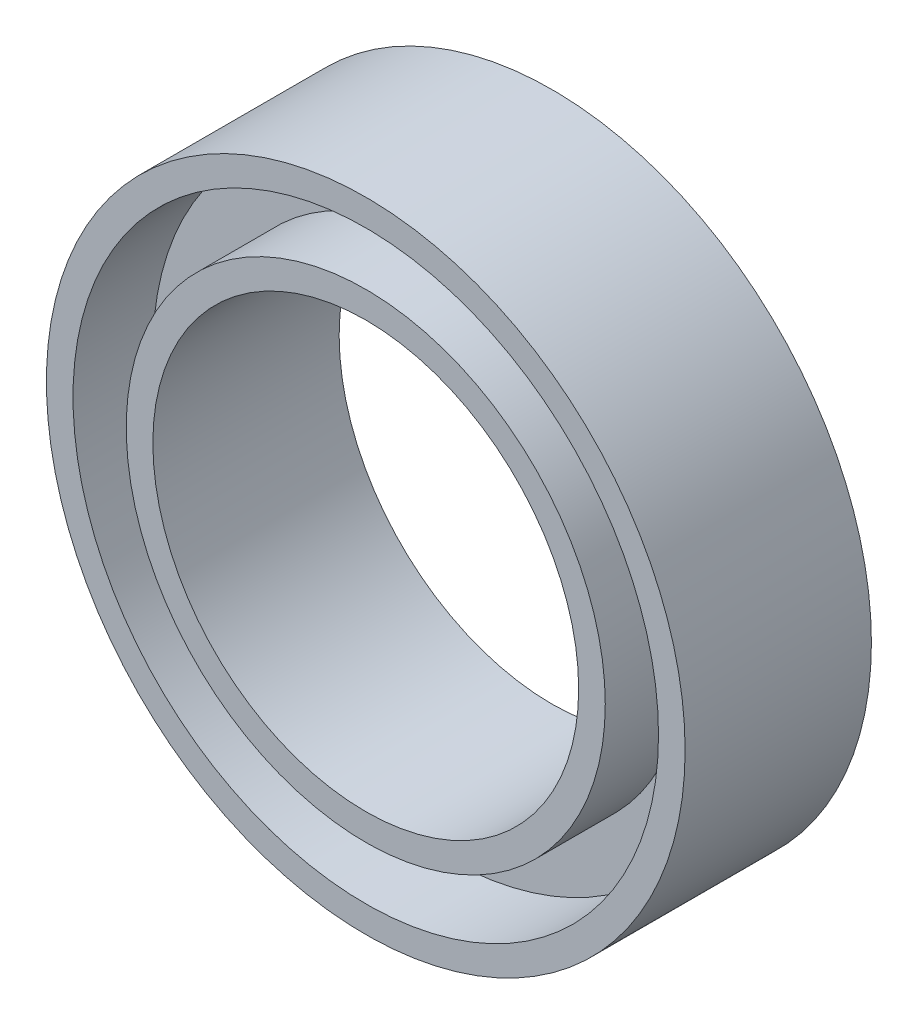
ISO-10303-21;
HEADER;
FILE_DESCRIPTION(('STEP AP214'),'2;1');
FILE_NAME('part.step','',(''),(''),'','','');
FILE_SCHEMA(('AUTOMOTIVE_DESIGN { 1 0 10303 214 1 1 1 1 }'));
ENDSEC;
DATA;
#1=APPLICATION_CONTEXT('core data for automotive mechanical design processes');
#2=APPLICATION_PROTOCOL_DEFINITION('international standard','automotive_design',2000,#1);
#3=PRODUCT_CONTEXT('',#1,'mechanical');
#4=PRODUCT('Part','Part','',(#3));
#5=PRODUCT_RELATED_PRODUCT_CATEGORY('part','',(#4));
#6=PRODUCT_DEFINITION_FORMATION('','',#4);
#7=PRODUCT_DEFINITION_CONTEXT('part definition',#1,'design');
#8=PRODUCT_DEFINITION('design','',#6,#7);
#9=PRODUCT_DEFINITION_SHAPE('','',#8);
#10=(LENGTH_UNIT() NAMED_UNIT(*) SI_UNIT(.MILLI.,.METRE.));
#11=(NAMED_UNIT(*) PLANE_ANGLE_UNIT() SI_UNIT($,.RADIAN.));
#12=(NAMED_UNIT(*) SI_UNIT($,.STERADIAN.) SOLID_ANGLE_UNIT());
#13=UNCERTAINTY_MEASURE_WITH_UNIT(LENGTH_MEASURE(1.E-05),#10,'distance_accuracy_value','');
#14=(GEOMETRIC_REPRESENTATION_CONTEXT(3) GLOBAL_UNCERTAINTY_ASSIGNED_CONTEXT((#13)) GLOBAL_UNIT_ASSIGNED_CONTEXT((#10,
#11,#12)) REPRESENTATION_CONTEXT('',''));
#15=CARTESIAN_POINT('',(0.,0.,0.));
#16=DIRECTION('',(0.,0.,1.));
#17=DIRECTION('',(1.,0.,0.));
#18=AXIS2_PLACEMENT_3D('',#15,#16,#17);
#19=CARTESIAN_POINT('',(0.,0.,0.));
#20=DIRECTION('',(0.,0.,1.));
#21=DIRECTION('',(1.,0.,0.));
#22=AXIS2_PLACEMENT_3D('',#19,#20,#21);
#23=PLANE('',#22);
#24=CARTESIAN_POINT('',(0.,0.,0.));
#25=DIRECTION('',(0.,0.,1.));
#26=DIRECTION('',(1.,0.,0.));
#27=AXIS2_PLACEMENT_3D('',#24,#25,#26);
#28=CIRCLE('',#27,4.);
#29=CARTESIAN_POINT('',(4.,0.,0.));
#30=VERTEX_POINT('',#29);
#31=EDGE_CURVE('E47',#30,#30,#28,.T.);
#32=ORIENTED_EDGE('',*,*,#31,.T.);
#33=EDGE_LOOP('',(#32));
#34=FACE_BOUND('',#33,.T.);
#35=CARTESIAN_POINT('',(0.,0.,0.));
#36=DIRECTION('',(0.,0.,-1.));
#37=DIRECTION('',(-1.,0.,0.));
#38=AXIS2_PLACEMENT_3D('',#35,#36,#37);
#39=CIRCLE('',#38,4.5);
#40=CARTESIAN_POINT('',(-4.5,0.,0.));
#41=VERTEX_POINT('',#40);
#42=EDGE_CURVE('E71',#41,#41,#39,.T.);
#43=ORIENTED_EDGE('',*,*,#42,.T.);
#44=EDGE_LOOP('',(#43));
#45=FACE_BOUND('',#44,.T.);
#46=ADVANCED_FACE('F34',(#34,#45),#23,.F.);
#47=CARTESIAN_POINT('',(0.,0.,3.5));
#48=DIRECTION('',(0.,0.,1.));
#49=DIRECTION('',(1.,0.,0.));
#50=AXIS2_PLACEMENT_3D('',#47,#48,#49);
#51=PLANE('',#50);
#52=CARTESIAN_POINT('',(0.,0.,3.5));
#53=DIRECTION('',(0.,0.,1.));
#54=DIRECTION('',(1.,0.,0.));
#55=AXIS2_PLACEMENT_3D('',#52,#53,#54);
#56=CIRCLE('',#55,4.);
#57=CARTESIAN_POINT('',(4.,0.,3.5));
#58=VERTEX_POINT('',#57);
#59=EDGE_CURVE('E45',#58,#58,#56,.T.);
#60=ORIENTED_EDGE('',*,*,#59,.F.);
#61=EDGE_LOOP('',(#60));
#62=FACE_BOUND('',#61,.T.);
#63=CARTESIAN_POINT('',(0.,0.,3.5));
#64=DIRECTION('',(0.,0.,1.));
#65=DIRECTION('',(1.,0.,0.));
#66=AXIS2_PLACEMENT_3D('',#63,#64,#65);
#67=CIRCLE('',#66,4.5);
#68=CARTESIAN_POINT('',(4.5,0.,3.5));
#69=VERTEX_POINT('',#68);
#70=EDGE_CURVE('E59',#69,#69,#67,.T.);
#71=ORIENTED_EDGE('',*,*,#70,.T.);
#72=EDGE_LOOP('',(#71));
#73=FACE_BOUND('',#72,.T.);
#74=ADVANCED_FACE('F109',(#62,#73),#51,.T.);
#75=CARTESIAN_POINT('',(0.,0.,3.5));
#76=DIRECTION('',(0.,0.,1.));
#77=DIRECTION('',(1.,0.,0.));
#78=AXIS2_PLACEMENT_3D('',#75,#76,#77);
#79=CIRCLE('',#78,5.5);
#80=CARTESIAN_POINT('',(5.5,0.,3.5));
#81=VERTEX_POINT('',#80);
#82=EDGE_CURVE('E53',#81,#81,#79,.T.);
#83=ORIENTED_EDGE('',*,*,#82,.F.);
#84=EDGE_LOOP('',(#83));
#85=FACE_BOUND('',#84,.T.);
#86=CARTESIAN_POINT('',(0.,0.,3.5));
#87=DIRECTION('',(0.,0.,1.));
#88=DIRECTION('',(1.,0.,0.));
#89=AXIS2_PLACEMENT_3D('',#86,#87,#88);
#90=CIRCLE('',#89,6.);
#91=CARTESIAN_POINT('',(6.,0.,3.5));
#92=VERTEX_POINT('',#91);
#93=EDGE_CURVE('E10',#92,#92,#90,.T.);
#94=ORIENTED_EDGE('',*,*,#93,.T.);
#95=EDGE_LOOP('',(#94));
#96=FACE_BOUND('',#95,.T.);
#97=ADVANCED_FACE('F96',(#85,#96),#51,.T.);
#98=CARTESIAN_POINT('',(0.,0.,0.));
#99=DIRECTION('',(0.,0.,-1.));
#100=DIRECTION('',(-1.,0.,0.));
#101=AXIS2_PLACEMENT_3D('',#98,#99,#100);
#102=CIRCLE('',#101,5.5);
#103=CARTESIAN_POINT('',(-5.5,0.,0.));
#104=VERTEX_POINT('',#103);
#105=EDGE_CURVE('E65',#104,#104,#102,.T.);
#106=ORIENTED_EDGE('',*,*,#105,.F.);
#107=EDGE_LOOP('',(#106));
#108=FACE_BOUND('',#107,.T.);
#109=CARTESIAN_POINT('',(0.,0.,0.));
#110=DIRECTION('',(0.,0.,1.));
#111=DIRECTION('',(1.,0.,0.));
#112=AXIS2_PLACEMENT_3D('',#109,#110,#111);
#113=CIRCLE('',#112,6.);
#114=CARTESIAN_POINT('',(6.,0.,0.));
#115=VERTEX_POINT('',#114);
#116=EDGE_CURVE('E38',#115,#115,#113,.T.);
#117=ORIENTED_EDGE('',*,*,#116,.F.);
#118=EDGE_LOOP('',(#117));
#119=FACE_BOUND('',#118,.T.);
#120=ADVANCED_FACE('F93',(#108,#119),#23,.F.);
#121=CARTESIAN_POINT('',(0.,0.,3.5));
#122=DIRECTION('',(0.,0.,-1.));
#123=DIRECTION('',(-1.,0.,0.));
#124=AXIS2_PLACEMENT_3D('',#121,#122,#123);
#125=CYLINDRICAL_SURFACE('',#124,6.);
#126=ORIENTED_EDGE('',*,*,#93,.F.);
#127=EDGE_LOOP('',(#126));
#128=FACE_BOUND('',#127,.T.);
#129=ORIENTED_EDGE('',*,*,#116,.T.);
#130=EDGE_LOOP('',(#129));
#131=FACE_BOUND('',#130,.T.);
#132=ADVANCED_FACE('F36',(#128,#131),#125,.T.);
#133=CARTESIAN_POINT('',(0.,0.,3.5));
#134=DIRECTION('',(0.,0.,-1.));
#135=DIRECTION('',(-1.,0.,0.));
#136=AXIS2_PLACEMENT_3D('',#133,#134,#135);
#137=CYLINDRICAL_SURFACE('',#136,4.);
#138=ORIENTED_EDGE('',*,*,#59,.T.);
#139=EDGE_LOOP('',(#138));
#140=FACE_BOUND('',#139,.T.);
#141=ORIENTED_EDGE('',*,*,#31,.F.);
#142=EDGE_LOOP('',(#141));
#143=FACE_BOUND('',#142,.T.);
#144=ADVANCED_FACE('F100',(#140,#143),#137,.F.);
#145=CARTESIAN_POINT('',(0.,0.,2.));
#146=DIRECTION('',(0.,0.,1.));
#147=DIRECTION('',(1.,0.,0.));
#148=AXIS2_PLACEMENT_3D('',#145,#146,#147);
#149=CYLINDRICAL_SURFACE('',#148,5.5);
#150=CARTESIAN_POINT('',(0.,0.,2.));
#151=DIRECTION('',(0.,0.,1.));
#152=DIRECTION('',(1.,0.,0.));
#153=AXIS2_PLACEMENT_3D('',#150,#151,#152);
#154=CIRCLE('',#153,5.5);
#155=CARTESIAN_POINT('',(5.5,0.,2.));
#156=VERTEX_POINT('',#155);
#157=EDGE_CURVE('E50',#156,#156,#154,.T.);
#158=ORIENTED_EDGE('',*,*,#157,.F.);
#159=EDGE_LOOP('',(#158));
#160=FACE_BOUND('',#159,.T.);
#161=ORIENTED_EDGE('',*,*,#82,.T.);
#162=EDGE_LOOP('',(#161));
#163=FACE_BOUND('',#162,.T.);
#164=ADVANCED_FACE('F105',(#160,#163),#149,.F.);
#165=CARTESIAN_POINT('',(0.,0.,2.));
#166=DIRECTION('',(0.,0.,1.));
#167=DIRECTION('',(1.,0.,0.));
#168=AXIS2_PLACEMENT_3D('',#165,#166,#167);
#169=PLANE('',#168);
#170=CARTESIAN_POINT('',(0.,0.,2.));
#171=DIRECTION('',(0.,0.,1.));
#172=DIRECTION('',(1.,0.,0.));
#173=AXIS2_PLACEMENT_3D('',#170,#171,#172);
#174=CIRCLE('',#173,4.5);
#175=CARTESIAN_POINT('',(4.5,0.,2.));
#176=VERTEX_POINT('',#175);
#177=EDGE_CURVE('E56',#176,#176,#174,.T.);
#178=ORIENTED_EDGE('',*,*,#177,.F.);
#179=EDGE_LOOP('',(#178));
#180=FACE_BOUND('',#179,.T.);
#181=ORIENTED_EDGE('',*,*,#157,.T.);
#182=EDGE_LOOP('',(#181));
#183=FACE_BOUND('',#182,.T.);
#184=ADVANCED_FACE('F122',(#180,#183),#169,.T.);
#185=CARTESIAN_POINT('',(0.,0.,2.));
#186=DIRECTION('',(0.,0.,1.));
#187=DIRECTION('',(1.,0.,0.));
#188=AXIS2_PLACEMENT_3D('',#185,#186,#187);
#189=CYLINDRICAL_SURFACE('',#188,4.5);
#190=ORIENTED_EDGE('',*,*,#177,.T.);
#191=EDGE_LOOP('',(#190));
#192=FACE_BOUND('',#191,.T.);
#193=ORIENTED_EDGE('',*,*,#70,.F.);
#194=EDGE_LOOP('',(#193));
#195=FACE_BOUND('',#194,.T.);
#196=ADVANCED_FACE('F89',(#192,#195),#189,.T.);
#197=CARTESIAN_POINT('',(0.,0.,1.5));
#198=DIRECTION('',(0.,0.,-1.));
#199=DIRECTION('',(-1.,0.,0.));
#200=AXIS2_PLACEMENT_3D('',#197,#198,#199);
#201=CYLINDRICAL_SURFACE('',#200,5.5);
#202=CARTESIAN_POINT('',(0.,0.,1.5));
#203=DIRECTION('',(0.,0.,-1.));
#204=DIRECTION('',(-1.,0.,0.));
#205=AXIS2_PLACEMENT_3D('',#202,#203,#204);
#206=CIRCLE('',#205,5.5);
#207=CARTESIAN_POINT('',(-5.5,0.,1.5));
#208=VERTEX_POINT('',#207);
#209=EDGE_CURVE('E62',#208,#208,#206,.T.);
#210=ORIENTED_EDGE('',*,*,#209,.F.);
#211=EDGE_LOOP('',(#210));
#212=FACE_BOUND('',#211,.T.);
#213=ORIENTED_EDGE('',*,*,#105,.T.);
#214=EDGE_LOOP('',(#213));
#215=FACE_BOUND('',#214,.T.);
#216=ADVANCED_FACE('F83',(#212,#215),#201,.F.);
#217=CARTESIAN_POINT('',(0.,0.,1.5));
#218=DIRECTION('',(0.,0.,-1.));
#219=DIRECTION('',(-1.,0.,0.));
#220=AXIS2_PLACEMENT_3D('',#217,#218,#219);
#221=PLANE('',#220);
#222=CARTESIAN_POINT('',(0.,0.,1.5));
#223=DIRECTION('',(0.,0.,-1.));
#224=DIRECTION('',(-1.,0.,0.));
#225=AXIS2_PLACEMENT_3D('',#222,#223,#224);
#226=CIRCLE('',#225,4.5);
#227=CARTESIAN_POINT('',(-4.5,0.,1.5));
#228=VERTEX_POINT('',#227);
#229=EDGE_CURVE('E68',#228,#228,#226,.T.);
#230=ORIENTED_EDGE('',*,*,#229,.F.);
#231=EDGE_LOOP('',(#230));
#232=FACE_BOUND('',#231,.T.);
#233=ORIENTED_EDGE('',*,*,#209,.T.);
#234=EDGE_LOOP('',(#233));
#235=FACE_BOUND('',#234,.T.);
#236=ADVANCED_FACE('F80',(#232,#235),#221,.T.);
#237=CARTESIAN_POINT('',(0.,0.,1.5));
#238=DIRECTION('',(0.,0.,-1.));
#239=DIRECTION('',(-1.,0.,0.));
#240=AXIS2_PLACEMENT_3D('',#237,#238,#239);
#241=CYLINDRICAL_SURFACE('',#240,4.5);
#242=ORIENTED_EDGE('',*,*,#229,.T.);
#243=EDGE_LOOP('',(#242));
#244=FACE_BOUND('',#243,.T.);
#245=ORIENTED_EDGE('',*,*,#42,.F.);
#246=EDGE_LOOP('',(#245));
#247=FACE_BOUND('',#246,.T.);
#248=ADVANCED_FACE('F77',(#244,#247),#241,.T.);
#249=CLOSED_SHELL('',(#46,#74,#97,#120,#132,#144,#164,#184,#196,#216,#236,#248));
#250=MANIFOLD_SOLID_BREP('B2',#249);
#251=ADVANCED_BREP_SHAPE_REPRESENTATION('',(#18,#250),#14);
#252=SHAPE_DEFINITION_REPRESENTATION(#9,#251);
ENDSEC;
END-ISO-10303-21;
